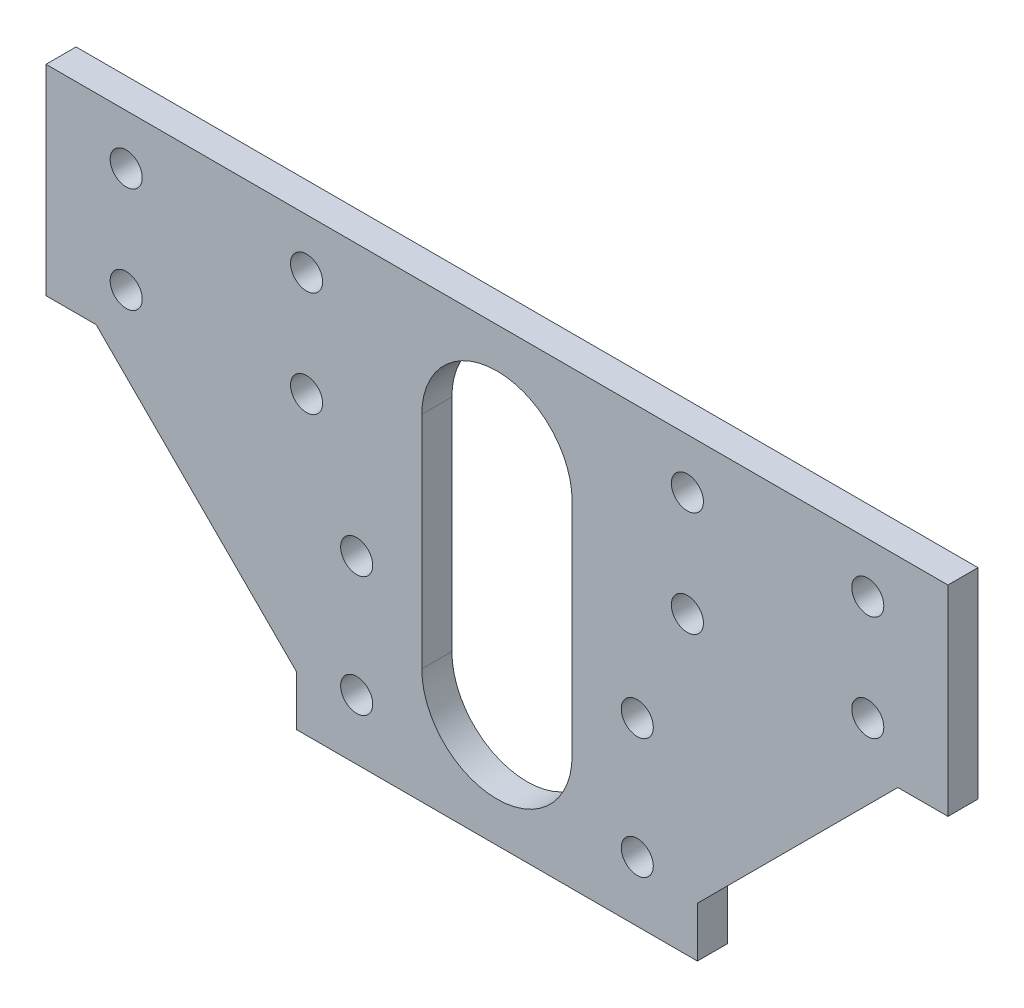
ISO-10303-21;
HEADER;
FILE_DESCRIPTION(('STEP AP214'),'2;1');
FILE_NAME('part.step','',(''),(''),'','','');
FILE_SCHEMA(('AUTOMOTIVE_DESIGN { 1 0 10303 214 1 1 1 1 }'));
ENDSEC;
DATA;
#1=APPLICATION_CONTEXT('core data for automotive mechanical design processes');
#2=APPLICATION_PROTOCOL_DEFINITION('international standard','automotive_design',2000,#1);
#3=PRODUCT_CONTEXT('',#1,'mechanical');
#4=PRODUCT('Part','Part','',(#3));
#5=PRODUCT_RELATED_PRODUCT_CATEGORY('part','',(#4));
#6=PRODUCT_DEFINITION_FORMATION('','',#4);
#7=PRODUCT_DEFINITION_CONTEXT('part definition',#1,'design');
#8=PRODUCT_DEFINITION('design','',#6,#7);
#9=PRODUCT_DEFINITION_SHAPE('','',#8);
#10=(LENGTH_UNIT() NAMED_UNIT(*) SI_UNIT(.MILLI.,.METRE.));
#11=(NAMED_UNIT(*) PLANE_ANGLE_UNIT() SI_UNIT($,.RADIAN.));
#12=(NAMED_UNIT(*) SI_UNIT($,.STERADIAN.) SOLID_ANGLE_UNIT());
#13=UNCERTAINTY_MEASURE_WITH_UNIT(LENGTH_MEASURE(1.E-05),#10,'distance_accuracy_value','');
#14=(GEOMETRIC_REPRESENTATION_CONTEXT(3) GLOBAL_UNCERTAINTY_ASSIGNED_CONTEXT((#13)) GLOBAL_UNIT_ASSIGNED_CONTEXT((#10,
#11,#12)) REPRESENTATION_CONTEXT('',''));
#15=CARTESIAN_POINT('',(0.,0.,0.));
#16=DIRECTION('',(0.,0.,1.));
#17=DIRECTION('',(1.,0.,0.));
#18=AXIS2_PLACEMENT_3D('',#15,#16,#17);
#19=CARTESIAN_POINT('',(0.,-20.,3.));
#20=DIRECTION('',(1.,0.,0.));
#21=DIRECTION('',(0.,0.,-1.));
#22=AXIS2_PLACEMENT_3D('',#19,#20,#21);
#23=PLANE('',#22);
#24=DIRECTION('',(0.,-1.,0.));
#25=VECTOR('',#24,1.);
#26=CARTESIAN_POINT('',(0.,-20.,0.));
#27=LINE('',#26,#25);
#28=CARTESIAN_POINT('',(0.,0.,0.));
#29=VERTEX_POINT('',#28);
#30=CARTESIAN_POINT('',(0.,-20.,0.));
#31=VERTEX_POINT('',#30);
#32=EDGE_CURVE('E239',#29,#31,#27,.T.);
#33=ORIENTED_EDGE('',*,*,#32,.T.);
#34=DIRECTION('',(0.,0.,-1.));
#35=VECTOR('',#34,1.);
#36=CARTESIAN_POINT('',(0.,-20.,3.));
#37=LINE('',#36,#35);
#38=CARTESIAN_POINT('',(0.,-20.,3.));
#39=VERTEX_POINT('',#38);
#40=EDGE_CURVE('E11',#39,#31,#37,.T.);
#41=ORIENTED_EDGE('',*,*,#40,.F.);
#42=DIRECTION('',(0.,-1.,0.));
#43=VECTOR('',#42,1.);
#44=CARTESIAN_POINT('',(0.,-20.,3.));
#45=LINE('',#44,#43);
#46=CARTESIAN_POINT('',(0.,0.,3.));
#47=VERTEX_POINT('',#46);
#48=EDGE_CURVE('E242',#47,#39,#45,.T.);
#49=ORIENTED_EDGE('',*,*,#48,.F.);
#50=DIRECTION('',(0.,0.,-1.));
#51=VECTOR('',#50,1.);
#52=CARTESIAN_POINT('',(0.,0.,3.));
#53=LINE('',#52,#51);
#54=EDGE_CURVE('E264',#47,#29,#53,.T.);
#55=ORIENTED_EDGE('',*,*,#54,.T.);
#56=EDGE_LOOP('',(#33,#41,#49,#55));
#57=FACE_BOUND('',#56,.T.);
#58=ADVANCED_FACE('F35',(#57),#23,.F.);
#59=CARTESIAN_POINT('',(5.,-20.,3.));
#60=DIRECTION('',(0.,1.,0.));
#61=DIRECTION('',(-1.,0.,0.));
#62=AXIS2_PLACEMENT_3D('',#59,#60,#61);
#63=PLANE('',#62);
#64=DIRECTION('',(1.,0.,0.));
#65=VECTOR('',#64,1.);
#66=CARTESIAN_POINT('',(5.,-20.,0.));
#67=LINE('',#66,#65);
#68=CARTESIAN_POINT('',(5.,-20.,0.));
#69=VERTEX_POINT('',#68);
#70=EDGE_CURVE('E267',#31,#69,#67,.T.);
#71=ORIENTED_EDGE('',*,*,#70,.T.);
#72=DIRECTION('',(0.,0.,-1.));
#73=VECTOR('',#72,1.);
#74=CARTESIAN_POINT('',(5.,-20.,3.));
#75=LINE('',#74,#73);
#76=CARTESIAN_POINT('',(5.,-20.,3.));
#77=VERTEX_POINT('',#76);
#78=EDGE_CURVE('E42',#77,#69,#75,.T.);
#79=ORIENTED_EDGE('',*,*,#78,.F.);
#80=DIRECTION('',(1.,0.,0.));
#81=VECTOR('',#80,1.);
#82=CARTESIAN_POINT('',(5.,-20.,3.));
#83=LINE('',#82,#81);
#84=EDGE_CURVE('E245',#39,#77,#83,.T.);
#85=ORIENTED_EDGE('',*,*,#84,.F.);
#86=ORIENTED_EDGE('',*,*,#40,.T.);
#87=EDGE_LOOP('',(#71,#79,#85,#86));
#88=FACE_BOUND('',#87,.T.);
#89=ADVANCED_FACE('F333',(#88),#63,.F.);
#90=CARTESIAN_POINT('',(25.,-39.9999999999998,3.));
#91=DIRECTION('',(0.707106781186543,0.707106781186552,0.));
#92=DIRECTION('',(-0.707106781186552,0.707106781186543,0.));
#93=AXIS2_PLACEMENT_3D('',#90,#91,#92);
#94=PLANE('',#93);
#95=DIRECTION('',(0.707106781186552,-0.707106781186543,0.));
#96=VECTOR('',#95,1.);
#97=CARTESIAN_POINT('',(25.,-39.9999999999998,0.));
#98=LINE('',#97,#96);
#99=CARTESIAN_POINT('',(25.,-39.9999999999998,0.));
#100=VERTEX_POINT('',#99);
#101=EDGE_CURVE('E269',#69,#100,#98,.T.);
#102=ORIENTED_EDGE('',*,*,#101,.T.);
#103=DIRECTION('',(0.,0.,-1.));
#104=VECTOR('',#103,1.);
#105=CARTESIAN_POINT('',(25.,-39.9999999999998,3.));
#106=LINE('',#105,#104);
#107=CARTESIAN_POINT('',(25.,-39.9999999999998,3.));
#108=VERTEX_POINT('',#107);
#109=EDGE_CURVE('E304',#108,#100,#106,.T.);
#110=ORIENTED_EDGE('',*,*,#109,.F.);
#111=DIRECTION('',(0.707106781186552,-0.707106781186543,0.));
#112=VECTOR('',#111,1.);
#113=CARTESIAN_POINT('',(25.,-39.9999999999998,3.));
#114=LINE('',#113,#112);
#115=EDGE_CURVE('E248',#77,#108,#114,.T.);
#116=ORIENTED_EDGE('',*,*,#115,.F.);
#117=ORIENTED_EDGE('',*,*,#78,.T.);
#118=EDGE_LOOP('',(#102,#110,#116,#117));
#119=FACE_BOUND('',#118,.T.);
#120=ADVANCED_FACE('F311',(#119),#94,.F.);
#121=CARTESIAN_POINT('',(25.,-45.,3.));
#122=DIRECTION('',(1.,0.,0.));
#123=DIRECTION('',(0.,0.,-1.));
#124=AXIS2_PLACEMENT_3D('',#121,#122,#123);
#125=PLANE('',#124);
#126=DIRECTION('',(0.,-1.,0.));
#127=VECTOR('',#126,1.);
#128=CARTESIAN_POINT('',(25.,-45.,0.));
#129=LINE('',#128,#127);
#130=CARTESIAN_POINT('',(25.,-45.,0.));
#131=VERTEX_POINT('',#130);
#132=EDGE_CURVE('E271',#100,#131,#129,.T.);
#133=ORIENTED_EDGE('',*,*,#132,.T.);
#134=DIRECTION('',(0.,0.,-1.));
#135=VECTOR('',#134,1.);
#136=CARTESIAN_POINT('',(25.,-45.,3.));
#137=LINE('',#136,#135);
#138=CARTESIAN_POINT('',(25.,-45.,3.));
#139=VERTEX_POINT('',#138);
#140=EDGE_CURVE('E301',#139,#131,#137,.T.);
#141=ORIENTED_EDGE('',*,*,#140,.F.);
#142=DIRECTION('',(0.,-1.,0.));
#143=VECTOR('',#142,1.);
#144=CARTESIAN_POINT('',(25.,-45.,3.));
#145=LINE('',#144,#143);
#146=EDGE_CURVE('E250',#108,#139,#145,.T.);
#147=ORIENTED_EDGE('',*,*,#146,.F.);
#148=ORIENTED_EDGE('',*,*,#109,.T.);
#149=EDGE_LOOP('',(#133,#141,#147,#148));
#150=FACE_BOUND('',#149,.T.);
#151=ADVANCED_FACE('F321',(#150),#125,.F.);
#152=CARTESIAN_POINT('',(65.,-45.,3.));
#153=DIRECTION('',(0.,1.,0.));
#154=DIRECTION('',(0.,0.,1.));
#155=AXIS2_PLACEMENT_3D('',#152,#153,#154);
#156=PLANE('',#155);
#157=DIRECTION('',(1.,0.,0.));
#158=VECTOR('',#157,1.);
#159=CARTESIAN_POINT('',(65.,-45.,0.));
#160=LINE('',#159,#158);
#161=CARTESIAN_POINT('',(65.,-45.,0.));
#162=VERTEX_POINT('',#161);
#163=EDGE_CURVE('E273',#131,#162,#160,.T.);
#164=ORIENTED_EDGE('',*,*,#163,.T.);
#165=DIRECTION('',(0.,0.,-1.));
#166=VECTOR('',#165,1.);
#167=CARTESIAN_POINT('',(65.,-45.,3.));
#168=LINE('',#167,#166);
#169=CARTESIAN_POINT('',(65.,-45.,3.));
#170=VERTEX_POINT('',#169);
#171=EDGE_CURVE('E298',#170,#162,#168,.T.);
#172=ORIENTED_EDGE('',*,*,#171,.F.);
#173=DIRECTION('',(1.,0.,0.));
#174=VECTOR('',#173,1.);
#175=CARTESIAN_POINT('',(65.,-45.,3.));
#176=LINE('',#175,#174);
#177=EDGE_CURVE('E252',#139,#170,#176,.T.);
#178=ORIENTED_EDGE('',*,*,#177,.F.);
#179=ORIENTED_EDGE('',*,*,#140,.T.);
#180=EDGE_LOOP('',(#164,#172,#178,#179));
#181=FACE_BOUND('',#180,.T.);
#182=ADVANCED_FACE('F325',(#181),#156,.F.);
#183=CARTESIAN_POINT('',(65.,-40.0000000000002,3.));
#184=DIRECTION('',(-1.,0.,0.));
#185=DIRECTION('',(0.,0.,1.));
#186=AXIS2_PLACEMENT_3D('',#183,#184,#185);
#187=PLANE('',#186);
#188=DIRECTION('',(0.,1.,0.));
#189=VECTOR('',#188,1.);
#190=CARTESIAN_POINT('',(65.,-40.0000000000002,0.));
#191=LINE('',#190,#189);
#192=CARTESIAN_POINT('',(65.,-40.0000000000002,0.));
#193=VERTEX_POINT('',#192);
#194=EDGE_CURVE('E275',#162,#193,#191,.T.);
#195=ORIENTED_EDGE('',*,*,#194,.T.);
#196=DIRECTION('',(0.,0.,-1.));
#197=VECTOR('',#196,1.);
#198=CARTESIAN_POINT('',(65.,-40.0000000000002,3.));
#199=LINE('',#198,#197);
#200=CARTESIAN_POINT('',(65.,-40.0000000000002,3.));
#201=VERTEX_POINT('',#200);
#202=EDGE_CURVE('E295',#201,#193,#199,.T.);
#203=ORIENTED_EDGE('',*,*,#202,.F.);
#204=DIRECTION('',(0.,1.,0.));
#205=VECTOR('',#204,1.);
#206=CARTESIAN_POINT('',(65.,-40.0000000000002,3.));
#207=LINE('',#206,#205);
#208=EDGE_CURVE('E254',#170,#201,#207,.T.);
#209=ORIENTED_EDGE('',*,*,#208,.F.);
#210=ORIENTED_EDGE('',*,*,#171,.T.);
#211=EDGE_LOOP('',(#195,#203,#209,#210));
#212=FACE_BOUND('',#211,.T.);
#213=ADVANCED_FACE('F356',(#212),#187,.F.);
#214=CARTESIAN_POINT('',(85.,-20.,3.));
#215=DIRECTION('',(-0.707106781186552,0.707106781186543,0.));
#216=DIRECTION('',(-0.707106781186543,-0.707106781186552,0.));
#217=AXIS2_PLACEMENT_3D('',#214,#215,#216);
#218=PLANE('',#217);
#219=DIRECTION('',(0.707106781186543,0.707106781186552,0.));
#220=VECTOR('',#219,1.);
#221=CARTESIAN_POINT('',(85.,-20.,0.));
#222=LINE('',#221,#220);
#223=CARTESIAN_POINT('',(85.,-20.,0.));
#224=VERTEX_POINT('',#223);
#225=EDGE_CURVE('E277',#193,#224,#222,.T.);
#226=ORIENTED_EDGE('',*,*,#225,.T.);
#227=DIRECTION('',(0.,0.,-1.));
#228=VECTOR('',#227,1.);
#229=CARTESIAN_POINT('',(85.,-20.,3.));
#230=LINE('',#229,#228);
#231=CARTESIAN_POINT('',(85.,-20.,3.));
#232=VERTEX_POINT('',#231);
#233=EDGE_CURVE('E292',#232,#224,#230,.T.);
#234=ORIENTED_EDGE('',*,*,#233,.F.);
#235=DIRECTION('',(0.707106781186543,0.707106781186552,0.));
#236=VECTOR('',#235,1.);
#237=CARTESIAN_POINT('',(85.,-20.,3.));
#238=LINE('',#237,#236);
#239=EDGE_CURVE('E256',#201,#232,#238,.T.);
#240=ORIENTED_EDGE('',*,*,#239,.F.);
#241=ORIENTED_EDGE('',*,*,#202,.T.);
#242=EDGE_LOOP('',(#226,#234,#240,#241));
#243=FACE_BOUND('',#242,.T.);
#244=ADVANCED_FACE('F353',(#243),#218,.F.);
#245=CARTESIAN_POINT('',(90.,-20.,3.));
#246=DIRECTION('',(0.,1.,0.));
#247=DIRECTION('',(0.,0.,1.));
#248=AXIS2_PLACEMENT_3D('',#245,#246,#247);
#249=PLANE('',#248);
#250=DIRECTION('',(1.,0.,0.));
#251=VECTOR('',#250,1.);
#252=CARTESIAN_POINT('',(90.,-20.,0.));
#253=LINE('',#252,#251);
#254=CARTESIAN_POINT('',(90.,-20.,0.));
#255=VERTEX_POINT('',#254);
#256=EDGE_CURVE('E279',#224,#255,#253,.T.);
#257=ORIENTED_EDGE('',*,*,#256,.T.);
#258=DIRECTION('',(0.,0.,-1.));
#259=VECTOR('',#258,1.);
#260=CARTESIAN_POINT('',(90.,-20.,3.));
#261=LINE('',#260,#259);
#262=CARTESIAN_POINT('',(90.,-20.,3.));
#263=VERTEX_POINT('',#262);
#264=EDGE_CURVE('E289',#263,#255,#261,.T.);
#265=ORIENTED_EDGE('',*,*,#264,.F.);
#266=DIRECTION('',(1.,0.,0.));
#267=VECTOR('',#266,1.);
#268=CARTESIAN_POINT('',(90.,-20.,3.));
#269=LINE('',#268,#267);
#270=EDGE_CURVE('E258',#232,#263,#269,.T.);
#271=ORIENTED_EDGE('',*,*,#270,.F.);
#272=ORIENTED_EDGE('',*,*,#233,.T.);
#273=EDGE_LOOP('',(#257,#265,#271,#272));
#274=FACE_BOUND('',#273,.T.);
#275=ADVANCED_FACE('F349',(#274),#249,.F.);
#276=CARTESIAN_POINT('',(90.,0.,3.));
#277=DIRECTION('',(-1.,0.,0.));
#278=DIRECTION('',(0.,0.,1.));
#279=AXIS2_PLACEMENT_3D('',#276,#277,#278);
#280=PLANE('',#279);
#281=DIRECTION('',(0.,1.,0.));
#282=VECTOR('',#281,1.);
#283=CARTESIAN_POINT('',(90.,0.,0.));
#284=LINE('',#283,#282);
#285=CARTESIAN_POINT('',(90.,0.,0.));
#286=VERTEX_POINT('',#285);
#287=EDGE_CURVE('E281',#255,#286,#284,.T.);
#288=ORIENTED_EDGE('',*,*,#287,.T.);
#289=DIRECTION('',(0.,0.,-1.));
#290=VECTOR('',#289,1.);
#291=CARTESIAN_POINT('',(90.,0.,3.));
#292=LINE('',#291,#290);
#293=CARTESIAN_POINT('',(90.,0.,3.));
#294=VERTEX_POINT('',#293);
#295=EDGE_CURVE('E286',#294,#286,#292,.T.);
#296=ORIENTED_EDGE('',*,*,#295,.F.);
#297=DIRECTION('',(0.,1.,0.));
#298=VECTOR('',#297,1.);
#299=CARTESIAN_POINT('',(90.,0.,3.));
#300=LINE('',#299,#298);
#301=EDGE_CURVE('E260',#263,#294,#300,.T.);
#302=ORIENTED_EDGE('',*,*,#301,.F.);
#303=ORIENTED_EDGE('',*,*,#264,.T.);
#304=EDGE_LOOP('',(#288,#296,#302,#303));
#305=FACE_BOUND('',#304,.T.);
#306=ADVANCED_FACE('F345',(#305),#280,.F.);
#307=CARTESIAN_POINT('',(0.,0.,3.));
#308=DIRECTION('',(0.,-1.,0.));
#309=DIRECTION('',(0.,0.,-1.));
#310=AXIS2_PLACEMENT_3D('',#307,#308,#309);
#311=PLANE('',#310);
#312=DIRECTION('',(-1.,0.,0.));
#313=VECTOR('',#312,1.);
#314=CARTESIAN_POINT('',(0.,0.,0.));
#315=LINE('',#314,#313);
#316=EDGE_CURVE('E246',#286,#29,#315,.T.);
#317=ORIENTED_EDGE('',*,*,#316,.T.);
#318=ORIENTED_EDGE('',*,*,#54,.F.);
#319=DIRECTION('',(-1.,0.,0.));
#320=VECTOR('',#319,1.);
#321=CARTESIAN_POINT('',(0.,0.,3.));
#322=LINE('',#321,#320);
#323=EDGE_CURVE('E262',#294,#47,#322,.T.);
#324=ORIENTED_EDGE('',*,*,#323,.F.);
#325=ORIENTED_EDGE('',*,*,#295,.T.);
#326=EDGE_LOOP('',(#317,#318,#324,#325));
#327=FACE_BOUND('',#326,.T.);
#328=ADVANCED_FACE('F340',(#327),#311,.F.);
#329=CARTESIAN_POINT('',(0.,0.,3.));
#330=DIRECTION('',(0.,0.,-1.));
#331=DIRECTION('',(-1.,0.,0.));
#332=AXIS2_PLACEMENT_3D('',#329,#330,#331);
#333=PLANE('',#332);
#334=CARTESIAN_POINT('',(26.,-15.5,3.));
#335=DIRECTION('',(0.,0.,1.));
#336=DIRECTION('',(1.,0.,0.));
#337=AXIS2_PLACEMENT_3D('',#334,#335,#336);
#338=CIRCLE('',#337,1.6);
#339=CARTESIAN_POINT('',(27.6,-15.5,3.));
#340=VERTEX_POINT('',#339);
#341=EDGE_CURVE('E204',#340,#340,#338,.T.);
#342=ORIENTED_EDGE('',*,*,#341,.F.);
#343=EDGE_LOOP('',(#342));
#344=FACE_BOUND('',#343,.T.);
#345=CARTESIAN_POINT('',(8.,-5.00000000000001,3.));
#346=DIRECTION('',(0.,0.,1.));
#347=DIRECTION('',(1.,0.,0.));
#348=AXIS2_PLACEMENT_3D('',#345,#346,#347);
#349=CIRCLE('',#348,1.6);
#350=CARTESIAN_POINT('',(9.6,-5.00000000000001,3.));
#351=VERTEX_POINT('',#350);
#352=EDGE_CURVE('E191',#351,#351,#349,.T.);
#353=ORIENTED_EDGE('',*,*,#352,.F.);
#354=EDGE_LOOP('',(#353));
#355=FACE_BOUND('',#354,.T.);
#356=CARTESIAN_POINT('',(8.,-15.5,3.));
#357=DIRECTION('',(0.,0.,1.));
#358=DIRECTION('',(1.,0.,0.));
#359=AXIS2_PLACEMENT_3D('',#356,#357,#358);
#360=CIRCLE('',#359,1.6);
#361=CARTESIAN_POINT('',(9.60000000000001,-15.5,3.));
#362=VERTEX_POINT('',#361);
#363=EDGE_CURVE('E192',#362,#362,#360,.T.);
#364=ORIENTED_EDGE('',*,*,#363,.F.);
#365=EDGE_LOOP('',(#364));
#366=FACE_BOUND('',#365,.T.);
#367=CARTESIAN_POINT('',(31.,-27.,3.));
#368=DIRECTION('',(0.,0.,1.));
#369=DIRECTION('',(1.,0.,0.));
#370=AXIS2_PLACEMENT_3D('',#367,#368,#369);
#371=CIRCLE('',#370,1.6);
#372=CARTESIAN_POINT('',(32.6,-27.,3.));
#373=VERTEX_POINT('',#372);
#374=EDGE_CURVE('E177',#373,#373,#371,.T.);
#375=ORIENTED_EDGE('',*,*,#374,.F.);
#376=EDGE_LOOP('',(#375));
#377=FACE_BOUND('',#376,.T.);
#378=CARTESIAN_POINT('',(26.,-5.00000000000001,3.));
#379=DIRECTION('',(0.,0.,1.));
#380=DIRECTION('',(1.,0.,0.));
#381=AXIS2_PLACEMENT_3D('',#378,#379,#380);
#382=CIRCLE('',#381,1.6);
#383=CARTESIAN_POINT('',(27.6,-5.00000000000001,3.));
#384=VERTEX_POINT('',#383);
#385=EDGE_CURVE('E203',#384,#384,#382,.T.);
#386=ORIENTED_EDGE('',*,*,#385,.F.);
#387=EDGE_LOOP('',(#386));
#388=FACE_BOUND('',#387,.T.);
#389=CARTESIAN_POINT('',(64.,-5.00000000000001,3.));
#390=DIRECTION('',(0.,0.,1.));
#391=DIRECTION('',(1.,0.,0.));
#392=AXIS2_PLACEMENT_3D('',#389,#390,#391);
#393=CIRCLE('',#392,1.60000000000001);
#394=CARTESIAN_POINT('',(65.6,-5.00000000000001,3.));
#395=VERTEX_POINT('',#394);
#396=EDGE_CURVE('E228',#395,#395,#393,.T.);
#397=ORIENTED_EDGE('',*,*,#396,.F.);
#398=EDGE_LOOP('',(#397));
#399=FACE_BOUND('',#398,.T.);
#400=CARTESIAN_POINT('',(64.,-15.5,3.));
#401=DIRECTION('',(0.,0.,1.));
#402=DIRECTION('',(1.,0.,0.));
#403=AXIS2_PLACEMENT_3D('',#400,#401,#402);
#404=CIRCLE('',#403,1.6);
#405=CARTESIAN_POINT('',(65.6,-15.5,3.));
#406=VERTEX_POINT('',#405);
#407=EDGE_CURVE('E222',#406,#406,#404,.T.);
#408=ORIENTED_EDGE('',*,*,#407,.F.);
#409=EDGE_LOOP('',(#408));
#410=FACE_BOUND('',#409,.T.);
#411=CARTESIAN_POINT('',(82.,-15.5,3.));
#412=DIRECTION('',(0.,0.,1.));
#413=DIRECTION('',(1.,0.,0.));
#414=AXIS2_PLACEMENT_3D('',#411,#412,#413);
#415=CIRCLE('',#414,1.6);
#416=CARTESIAN_POINT('',(83.6,-15.5,3.));
#417=VERTEX_POINT('',#416);
#418=EDGE_CURVE('E216',#417,#417,#415,.T.);
#419=ORIENTED_EDGE('',*,*,#418,.F.);
#420=EDGE_LOOP('',(#419));
#421=FACE_BOUND('',#420,.T.);
#422=DIRECTION('',(0.,-1.,0.));
#423=VECTOR('',#422,1.);
#424=CARTESIAN_POINT('',(37.5,-11.5,3.));
#425=LINE('',#424,#423);
#426=CARTESIAN_POINT('',(37.5,-11.5,3.));
#427=VERTEX_POINT('',#426);
#428=CARTESIAN_POINT('',(37.5,-33.5,3.));
#429=VERTEX_POINT('',#428);
#430=EDGE_CURVE('E165',#427,#429,#425,.T.);
#431=ORIENTED_EDGE('',*,*,#430,.F.);
#432=CARTESIAN_POINT('',(45.,-11.5,3.));
#433=DIRECTION('',(0.,0.,1.));
#434=DIRECTION('',(1.,0.,0.));
#435=AXIS2_PLACEMENT_3D('',#432,#433,#434);
#436=CIRCLE('',#435,7.50000000000001);
#437=CARTESIAN_POINT('',(52.5,-11.5,3.));
#438=VERTEX_POINT('',#437);
#439=EDGE_CURVE('E49',#438,#427,#436,.T.);
#440=ORIENTED_EDGE('',*,*,#439,.F.);
#441=DIRECTION('',(0.,1.,0.));
#442=VECTOR('',#441,1.);
#443=CARTESIAN_POINT('',(52.5,-11.5,3.));
#444=LINE('',#443,#442);
#445=CARTESIAN_POINT('',(52.5,-33.5,3.));
#446=VERTEX_POINT('',#445);
#447=EDGE_CURVE('E153',#446,#438,#444,.T.);
#448=ORIENTED_EDGE('',*,*,#447,.F.);
#449=CARTESIAN_POINT('',(45.,-33.5,3.));
#450=DIRECTION('',(0.,0.,1.));
#451=DIRECTION('',(1.,0.,0.));
#452=AXIS2_PLACEMENT_3D('',#449,#450,#451);
#453=CIRCLE('',#452,7.49999999999999);
#454=EDGE_CURVE('E156',#429,#446,#453,.T.);
#455=ORIENTED_EDGE('',*,*,#454,.F.);
#456=EDGE_LOOP('',(#431,#440,#448,#455));
#457=FACE_BOUND('',#456,.T.);
#458=CARTESIAN_POINT('',(59.,-39.,3.));
#459=DIRECTION('',(0.,0.,1.));
#460=DIRECTION('',(1.,0.,0.));
#461=AXIS2_PLACEMENT_3D('',#458,#459,#460);
#462=CIRCLE('',#461,1.6);
#463=CARTESIAN_POINT('',(60.6,-39.,3.));
#464=VERTEX_POINT('',#463);
#465=EDGE_CURVE('E159',#464,#464,#462,.T.);
#466=ORIENTED_EDGE('',*,*,#465,.F.);
#467=EDGE_LOOP('',(#466));
#468=FACE_BOUND('',#467,.T.);
#469=CARTESIAN_POINT('',(59.,-27.,3.));
#470=DIRECTION('',(0.,0.,1.));
#471=DIRECTION('',(1.,0.,0.));
#472=AXIS2_PLACEMENT_3D('',#469,#470,#471);
#473=CIRCLE('',#472,1.6);
#474=CARTESIAN_POINT('',(60.6,-27.,3.));
#475=VERTEX_POINT('',#474);
#476=EDGE_CURVE('E184',#475,#475,#473,.T.);
#477=ORIENTED_EDGE('',*,*,#476,.F.);
#478=EDGE_LOOP('',(#477));
#479=FACE_BOUND('',#478,.T.);
#480=CARTESIAN_POINT('',(31.,-39.,3.));
#481=DIRECTION('',(0.,0.,1.));
#482=DIRECTION('',(1.,0.,0.));
#483=AXIS2_PLACEMENT_3D('',#480,#481,#482);
#484=CIRCLE('',#483,1.6);
#485=CARTESIAN_POINT('',(32.6,-39.,3.));
#486=VERTEX_POINT('',#485);
#487=EDGE_CURVE('E178',#486,#486,#484,.T.);
#488=ORIENTED_EDGE('',*,*,#487,.F.);
#489=EDGE_LOOP('',(#488));
#490=FACE_BOUND('',#489,.T.);
#491=CARTESIAN_POINT('',(82.,-5.00000000000001,3.));
#492=DIRECTION('',(0.,0.,1.));
#493=DIRECTION('',(1.,0.,0.));
#494=AXIS2_PLACEMENT_3D('',#491,#492,#493);
#495=CIRCLE('',#494,1.60000000000001);
#496=CARTESIAN_POINT('',(83.6,-5.00000000000001,3.));
#497=VERTEX_POINT('',#496);
#498=EDGE_CURVE('E215',#497,#497,#495,.T.);
#499=ORIENTED_EDGE('',*,*,#498,.F.);
#500=EDGE_LOOP('',(#499));
#501=FACE_BOUND('',#500,.T.);
#502=ORIENTED_EDGE('',*,*,#48,.T.);
#503=ORIENTED_EDGE('',*,*,#84,.T.);
#504=ORIENTED_EDGE('',*,*,#115,.T.);
#505=ORIENTED_EDGE('',*,*,#146,.T.);
#506=ORIENTED_EDGE('',*,*,#177,.T.);
#507=ORIENTED_EDGE('',*,*,#208,.T.);
#508=ORIENTED_EDGE('',*,*,#239,.T.);
#509=ORIENTED_EDGE('',*,*,#270,.T.);
#510=ORIENTED_EDGE('',*,*,#301,.T.);
#511=ORIENTED_EDGE('',*,*,#323,.T.);
#512=EDGE_LOOP('',(#502,#503,#504,#505,#506,#507,#508,#509,#510,#511));
#513=FACE_BOUND('',#512,.T.);
#514=ADVANCED_FACE('F329',(#344,#355,#366,#377,#388,#399,#410,#421,#457,#468,#479,#490,#501,
#513),#333,.F.);
#515=CARTESIAN_POINT('',(0.,0.,0.));
#516=DIRECTION('',(0.,0.,-1.));
#517=DIRECTION('',(-1.,0.,0.));
#518=AXIS2_PLACEMENT_3D('',#515,#516,#517);
#519=PLANE('',#518);
#520=CARTESIAN_POINT('',(26.,-15.5,0.));
#521=DIRECTION('',(0.,0.,1.));
#522=DIRECTION('',(1.,0.,0.));
#523=AXIS2_PLACEMENT_3D('',#520,#521,#522);
#524=CIRCLE('',#523,1.6);
#525=CARTESIAN_POINT('',(27.6,-15.5,0.));
#526=VERTEX_POINT('',#525);
#527=EDGE_CURVE('E200',#526,#526,#524,.T.);
#528=ORIENTED_EDGE('',*,*,#527,.T.);
#529=EDGE_LOOP('',(#528));
#530=FACE_BOUND('',#529,.T.);
#531=CARTESIAN_POINT('',(8.,-5.00000000000001,0.));
#532=DIRECTION('',(0.,0.,1.));
#533=DIRECTION('',(1.,0.,0.));
#534=AXIS2_PLACEMENT_3D('',#531,#532,#533);
#535=CIRCLE('',#534,1.6);
#536=CARTESIAN_POINT('',(9.6,-5.00000000000001,0.));
#537=VERTEX_POINT('',#536);
#538=EDGE_CURVE('E207',#537,#537,#535,.T.);
#539=ORIENTED_EDGE('',*,*,#538,.T.);
#540=EDGE_LOOP('',(#539));
#541=FACE_BOUND('',#540,.T.);
#542=CARTESIAN_POINT('',(8.,-15.5,0.));
#543=DIRECTION('',(0.,0.,1.));
#544=DIRECTION('',(1.,0.,0.));
#545=AXIS2_PLACEMENT_3D('',#542,#543,#544);
#546=CIRCLE('',#545,1.6);
#547=CARTESIAN_POINT('',(9.60000000000001,-15.5,0.));
#548=VERTEX_POINT('',#547);
#549=EDGE_CURVE('E188',#548,#548,#546,.T.);
#550=ORIENTED_EDGE('',*,*,#549,.T.);
#551=EDGE_LOOP('',(#550));
#552=FACE_BOUND('',#551,.T.);
#553=CARTESIAN_POINT('',(31.,-27.,0.));
#554=DIRECTION('',(0.,0.,1.));
#555=DIRECTION('',(1.,0.,0.));
#556=AXIS2_PLACEMENT_3D('',#553,#554,#555);
#557=CIRCLE('',#556,1.6);
#558=CARTESIAN_POINT('',(32.6,-27.,0.));
#559=VERTEX_POINT('',#558);
#560=EDGE_CURVE('E195',#559,#559,#557,.T.);
#561=ORIENTED_EDGE('',*,*,#560,.T.);
#562=EDGE_LOOP('',(#561));
#563=FACE_BOUND('',#562,.T.);
#564=CARTESIAN_POINT('',(26.,-5.00000000000001,0.));
#565=DIRECTION('',(0.,0.,1.));
#566=DIRECTION('',(1.,0.,0.));
#567=AXIS2_PLACEMENT_3D('',#564,#565,#566);
#568=CIRCLE('',#567,1.6);
#569=CARTESIAN_POINT('',(27.6,-5.00000000000001,0.));
#570=VERTEX_POINT('',#569);
#571=EDGE_CURVE('E231',#570,#570,#568,.T.);
#572=ORIENTED_EDGE('',*,*,#571,.T.);
#573=EDGE_LOOP('',(#572));
#574=FACE_BOUND('',#573,.T.);
#575=CARTESIAN_POINT('',(64.,-5.00000000000001,0.));
#576=DIRECTION('',(0.,0.,1.));
#577=DIRECTION('',(1.,0.,0.));
#578=AXIS2_PLACEMENT_3D('',#575,#576,#577);
#579=CIRCLE('',#578,1.60000000000001);
#580=CARTESIAN_POINT('',(65.6,-5.00000000000001,0.));
#581=VERTEX_POINT('',#580);
#582=EDGE_CURVE('E225',#581,#581,#579,.T.);
#583=ORIENTED_EDGE('',*,*,#582,.T.);
#584=EDGE_LOOP('',(#583));
#585=FACE_BOUND('',#584,.T.);
#586=CARTESIAN_POINT('',(64.,-15.5,0.));
#587=DIRECTION('',(0.,0.,1.));
#588=DIRECTION('',(1.,0.,0.));
#589=AXIS2_PLACEMENT_3D('',#586,#587,#588);
#590=CIRCLE('',#589,1.6);
#591=CARTESIAN_POINT('',(65.6,-15.5,0.));
#592=VERTEX_POINT('',#591);
#593=EDGE_CURVE('E219',#592,#592,#590,.T.);
#594=ORIENTED_EDGE('',*,*,#593,.T.);
#595=EDGE_LOOP('',(#594));
#596=FACE_BOUND('',#595,.T.);
#597=CARTESIAN_POINT('',(82.,-15.5,0.));
#598=DIRECTION('',(0.,0.,1.));
#599=DIRECTION('',(1.,0.,0.));
#600=AXIS2_PLACEMENT_3D('',#597,#598,#599);
#601=CIRCLE('',#600,1.6);
#602=CARTESIAN_POINT('',(83.6,-15.5,0.));
#603=VERTEX_POINT('',#602);
#604=EDGE_CURVE('E212',#603,#603,#601,.T.);
#605=ORIENTED_EDGE('',*,*,#604,.T.);
#606=EDGE_LOOP('',(#605));
#607=FACE_BOUND('',#606,.T.);
#608=CARTESIAN_POINT('',(45.,-11.5,0.));
#609=DIRECTION('',(0.,0.,1.));
#610=DIRECTION('',(1.,0.,0.));
#611=AXIS2_PLACEMENT_3D('',#608,#609,#610);
#612=CIRCLE('',#611,7.50000000000001);
#613=CARTESIAN_POINT('',(52.5,-11.5,0.));
#614=VERTEX_POINT('',#613);
#615=CARTESIAN_POINT('',(37.5,-11.5,0.));
#616=VERTEX_POINT('',#615);
#617=EDGE_CURVE('E137',#614,#616,#612,.T.);
#618=ORIENTED_EDGE('',*,*,#617,.T.);
#619=DIRECTION('',(0.,-1.,0.));
#620=VECTOR('',#619,1.);
#621=CARTESIAN_POINT('',(37.5,-11.5,0.));
#622=LINE('',#621,#620);
#623=CARTESIAN_POINT('',(37.5,-33.5,0.));
#624=VERTEX_POINT('',#623);
#625=EDGE_CURVE('E146',#616,#624,#622,.T.);
#626=ORIENTED_EDGE('',*,*,#625,.T.);
#627=CARTESIAN_POINT('',(45.,-33.5,0.));
#628=DIRECTION('',(0.,0.,1.));
#629=DIRECTION('',(1.,0.,0.));
#630=AXIS2_PLACEMENT_3D('',#627,#628,#629);
#631=CIRCLE('',#630,7.49999999999999);
#632=CARTESIAN_POINT('',(52.5,-33.5,0.));
#633=VERTEX_POINT('',#632);
#634=EDGE_CURVE('E57',#624,#633,#631,.T.);
#635=ORIENTED_EDGE('',*,*,#634,.T.);
#636=DIRECTION('',(0.,1.,0.));
#637=VECTOR('',#636,1.);
#638=CARTESIAN_POINT('',(52.5,-11.5,0.));
#639=LINE('',#638,#637);
#640=EDGE_CURVE('E143',#633,#614,#639,.T.);
#641=ORIENTED_EDGE('',*,*,#640,.T.);
#642=EDGE_LOOP('',(#618,#626,#635,#641));
#643=FACE_BOUND('',#642,.T.);
#644=CARTESIAN_POINT('',(59.,-39.,0.));
#645=DIRECTION('',(0.,0.,1.));
#646=DIRECTION('',(1.,0.,0.));
#647=AXIS2_PLACEMENT_3D('',#644,#645,#646);
#648=CIRCLE('',#647,1.6);
#649=CARTESIAN_POINT('',(60.6,-39.,0.));
#650=VERTEX_POINT('',#649);
#651=EDGE_CURVE('E187',#650,#650,#648,.T.);
#652=ORIENTED_EDGE('',*,*,#651,.T.);
#653=EDGE_LOOP('',(#652));
#654=FACE_BOUND('',#653,.T.);
#655=CARTESIAN_POINT('',(59.,-27.,0.));
#656=DIRECTION('',(0.,0.,1.));
#657=DIRECTION('',(1.,0.,0.));
#658=AXIS2_PLACEMENT_3D('',#655,#656,#657);
#659=CIRCLE('',#658,1.6);
#660=CARTESIAN_POINT('',(60.6,-27.,0.));
#661=VERTEX_POINT('',#660);
#662=EDGE_CURVE('E181',#661,#661,#659,.T.);
#663=ORIENTED_EDGE('',*,*,#662,.T.);
#664=EDGE_LOOP('',(#663));
#665=FACE_BOUND('',#664,.T.);
#666=CARTESIAN_POINT('',(31.,-39.,0.));
#667=DIRECTION('',(0.,0.,1.));
#668=DIRECTION('',(1.,0.,0.));
#669=AXIS2_PLACEMENT_3D('',#666,#667,#668);
#670=CIRCLE('',#669,1.6);
#671=CARTESIAN_POINT('',(32.6,-39.,0.));
#672=VERTEX_POINT('',#671);
#673=EDGE_CURVE('E174',#672,#672,#670,.T.);
#674=ORIENTED_EDGE('',*,*,#673,.T.);
#675=EDGE_LOOP('',(#674));
#676=FACE_BOUND('',#675,.T.);
#677=CARTESIAN_POINT('',(82.,-5.00000000000001,0.));
#678=DIRECTION('',(0.,0.,1.));
#679=DIRECTION('',(1.,0.,0.));
#680=AXIS2_PLACEMENT_3D('',#677,#678,#679);
#681=CIRCLE('',#680,1.60000000000001);
#682=CARTESIAN_POINT('',(83.6,-5.00000000000001,0.));
#683=VERTEX_POINT('',#682);
#684=EDGE_CURVE('E236',#683,#683,#681,.T.);
#685=ORIENTED_EDGE('',*,*,#684,.T.);
#686=EDGE_LOOP('',(#685));
#687=FACE_BOUND('',#686,.T.);
#688=ORIENTED_EDGE('',*,*,#32,.F.);
#689=ORIENTED_EDGE('',*,*,#316,.F.);
#690=ORIENTED_EDGE('',*,*,#287,.F.);
#691=ORIENTED_EDGE('',*,*,#256,.F.);
#692=ORIENTED_EDGE('',*,*,#225,.F.);
#693=ORIENTED_EDGE('',*,*,#194,.F.);
#694=ORIENTED_EDGE('',*,*,#163,.F.);
#695=ORIENTED_EDGE('',*,*,#132,.F.);
#696=ORIENTED_EDGE('',*,*,#101,.F.);
#697=ORIENTED_EDGE('',*,*,#70,.F.);
#698=EDGE_LOOP('',(#688,#689,#690,#691,#692,#693,#694,#695,#696,#697));
#699=FACE_BOUND('',#698,.T.);
#700=ADVANCED_FACE('F150',(#530,#541,#552,#563,#574,#585,#596,#607,#643,#654,#665,#676,#687,
#699),#519,.T.);
#701=CARTESIAN_POINT('',(82.,-5.00000000000001,0.));
#702=DIRECTION('',(0.,0.,1.));
#703=DIRECTION('',(1.,0.,0.));
#704=AXIS2_PLACEMENT_3D('',#701,#702,#703);
#705=CYLINDRICAL_SURFACE('',#704,1.60000000000001);
#706=ORIENTED_EDGE('',*,*,#684,.F.);
#707=EDGE_LOOP('',(#706));
#708=FACE_BOUND('',#707,.T.);
#709=ORIENTED_EDGE('',*,*,#498,.T.);
#710=EDGE_LOOP('',(#709));
#711=FACE_BOUND('',#710,.T.);
#712=ADVANCED_FACE('F435',(#708,#711),#705,.F.);
#713=CARTESIAN_POINT('',(31.,-39.,0.));
#714=DIRECTION('',(0.,0.,1.));
#715=DIRECTION('',(1.,0.,0.));
#716=AXIS2_PLACEMENT_3D('',#713,#714,#715);
#717=CYLINDRICAL_SURFACE('',#716,1.6);
#718=ORIENTED_EDGE('',*,*,#673,.F.);
#719=EDGE_LOOP('',(#718));
#720=FACE_BOUND('',#719,.T.);
#721=ORIENTED_EDGE('',*,*,#487,.T.);
#722=EDGE_LOOP('',(#721));
#723=FACE_BOUND('',#722,.T.);
#724=ADVANCED_FACE('F445',(#720,#723),#717,.F.);
#725=CARTESIAN_POINT('',(59.,-27.,0.));
#726=DIRECTION('',(0.,0.,1.));
#727=DIRECTION('',(1.,0.,0.));
#728=AXIS2_PLACEMENT_3D('',#725,#726,#727);
#729=CYLINDRICAL_SURFACE('',#728,1.6);
#730=ORIENTED_EDGE('',*,*,#662,.F.);
#731=EDGE_LOOP('',(#730));
#732=FACE_BOUND('',#731,.T.);
#733=ORIENTED_EDGE('',*,*,#476,.T.);
#734=EDGE_LOOP('',(#733));
#735=FACE_BOUND('',#734,.T.);
#736=ADVANCED_FACE('F455',(#732,#735),#729,.F.);
#737=CARTESIAN_POINT('',(59.,-39.,0.));
#738=DIRECTION('',(0.,0.,1.));
#739=DIRECTION('',(1.,0.,0.));
#740=AXIS2_PLACEMENT_3D('',#737,#738,#739);
#741=CYLINDRICAL_SURFACE('',#740,1.6);
#742=ORIENTED_EDGE('',*,*,#651,.F.);
#743=EDGE_LOOP('',(#742));
#744=FACE_BOUND('',#743,.T.);
#745=ORIENTED_EDGE('',*,*,#465,.T.);
#746=EDGE_LOOP('',(#745));
#747=FACE_BOUND('',#746,.T.);
#748=ADVANCED_FACE('F465',(#744,#747),#741,.F.);
#749=CARTESIAN_POINT('',(45.,-11.5,0.));
#750=DIRECTION('',(0.,0.,1.));
#751=DIRECTION('',(1.,0.,0.));
#752=AXIS2_PLACEMENT_3D('',#749,#750,#751);
#753=CYLINDRICAL_SURFACE('',#752,7.50000000000001);
#754=ORIENTED_EDGE('',*,*,#439,.T.);
#755=DIRECTION('',(0.,0.,1.));
#756=VECTOR('',#755,1.);
#757=CARTESIAN_POINT('',(37.5,-11.5,0.));
#758=LINE('',#757,#756);
#759=EDGE_CURVE('E133',#616,#427,#758,.T.);
#760=ORIENTED_EDGE('',*,*,#759,.F.);
#761=ORIENTED_EDGE('',*,*,#617,.F.);
#762=DIRECTION('',(0.,0.,1.));
#763=VECTOR('',#762,1.);
#764=CARTESIAN_POINT('',(52.5,-11.5,0.));
#765=LINE('',#764,#763);
#766=EDGE_CURVE('E169',#614,#438,#765,.T.);
#767=ORIENTED_EDGE('',*,*,#766,.T.);
#768=EDGE_LOOP('',(#754,#760,#761,#767));
#769=FACE_BOUND('',#768,.T.);
#770=ADVANCED_FACE('F135',(#769),#753,.F.);
#771=CARTESIAN_POINT('',(52.5,-11.5,0.));
#772=DIRECTION('',(1.,0.,0.));
#773=DIRECTION('',(0.,1.,0.));
#774=AXIS2_PLACEMENT_3D('',#771,#772,#773);
#775=PLANE('',#774);
#776=ORIENTED_EDGE('',*,*,#447,.T.);
#777=ORIENTED_EDGE('',*,*,#766,.F.);
#778=ORIENTED_EDGE('',*,*,#640,.F.);
#779=DIRECTION('',(0.,0.,1.));
#780=VECTOR('',#779,1.);
#781=CARTESIAN_POINT('',(52.5,-33.5,0.));
#782=LINE('',#781,#780);
#783=EDGE_CURVE('E171',#633,#446,#782,.T.);
#784=ORIENTED_EDGE('',*,*,#783,.T.);
#785=EDGE_LOOP('',(#776,#777,#778,#784));
#786=FACE_BOUND('',#785,.T.);
#787=ADVANCED_FACE('F484',(#786),#775,.F.);
#788=CARTESIAN_POINT('',(45.,-33.5,0.));
#789=DIRECTION('',(0.,0.,1.));
#790=DIRECTION('',(1.,0.,0.));
#791=AXIS2_PLACEMENT_3D('',#788,#789,#790);
#792=CYLINDRICAL_SURFACE('',#791,7.49999999999999);
#793=ORIENTED_EDGE('',*,*,#454,.T.);
#794=ORIENTED_EDGE('',*,*,#783,.F.);
#795=ORIENTED_EDGE('',*,*,#634,.F.);
#796=DIRECTION('',(0.,0.,1.));
#797=VECTOR('',#796,1.);
#798=CARTESIAN_POINT('',(37.5,-33.5,0.));
#799=LINE('',#798,#797);
#800=EDGE_CURVE('E142',#624,#429,#799,.T.);
#801=ORIENTED_EDGE('',*,*,#800,.T.);
#802=EDGE_LOOP('',(#793,#794,#795,#801));
#803=FACE_BOUND('',#802,.T.);
#804=ADVANCED_FACE('F493',(#803),#792,.F.);
#805=CARTESIAN_POINT('',(37.5,-11.5,0.));
#806=DIRECTION('',(-1.,0.,0.));
#807=DIRECTION('',(0.,-1.,0.));
#808=AXIS2_PLACEMENT_3D('',#805,#806,#807);
#809=PLANE('',#808);
#810=ORIENTED_EDGE('',*,*,#430,.T.);
#811=ORIENTED_EDGE('',*,*,#800,.F.);
#812=ORIENTED_EDGE('',*,*,#625,.F.);
#813=ORIENTED_EDGE('',*,*,#759,.T.);
#814=EDGE_LOOP('',(#810,#811,#812,#813));
#815=FACE_BOUND('',#814,.T.);
#816=ADVANCED_FACE('F147',(#815),#809,.F.);
#817=CARTESIAN_POINT('',(82.,-15.5,0.));
#818=DIRECTION('',(0.,0.,1.));
#819=DIRECTION('',(1.,0.,0.));
#820=AXIS2_PLACEMENT_3D('',#817,#818,#819);
#821=CYLINDRICAL_SURFACE('',#820,1.6);
#822=ORIENTED_EDGE('',*,*,#604,.F.);
#823=EDGE_LOOP('',(#822));
#824=FACE_BOUND('',#823,.T.);
#825=ORIENTED_EDGE('',*,*,#418,.T.);
#826=EDGE_LOOP('',(#825));
#827=FACE_BOUND('',#826,.T.);
#828=ADVANCED_FACE('F511',(#824,#827),#821,.F.);
#829=CARTESIAN_POINT('',(64.,-15.5,0.));
#830=DIRECTION('',(0.,0.,1.));
#831=DIRECTION('',(1.,0.,0.));
#832=AXIS2_PLACEMENT_3D('',#829,#830,#831);
#833=CYLINDRICAL_SURFACE('',#832,1.6);
#834=ORIENTED_EDGE('',*,*,#593,.F.);
#835=EDGE_LOOP('',(#834));
#836=FACE_BOUND('',#835,.T.);
#837=ORIENTED_EDGE('',*,*,#407,.T.);
#838=EDGE_LOOP('',(#837));
#839=FACE_BOUND('',#838,.T.);
#840=ADVANCED_FACE('F520',(#836,#839),#833,.F.);
#841=CARTESIAN_POINT('',(64.,-5.00000000000001,0.));
#842=DIRECTION('',(0.,0.,1.));
#843=DIRECTION('',(1.,0.,0.));
#844=AXIS2_PLACEMENT_3D('',#841,#842,#843);
#845=CYLINDRICAL_SURFACE('',#844,1.60000000000001);
#846=ORIENTED_EDGE('',*,*,#582,.F.);
#847=EDGE_LOOP('',(#846));
#848=FACE_BOUND('',#847,.T.);
#849=ORIENTED_EDGE('',*,*,#396,.T.);
#850=EDGE_LOOP('',(#849));
#851=FACE_BOUND('',#850,.T.);
#852=ADVANCED_FACE('F530',(#848,#851),#845,.F.);
#853=CARTESIAN_POINT('',(26.,-5.00000000000001,0.));
#854=DIRECTION('',(0.,0.,1.));
#855=DIRECTION('',(1.,0.,0.));
#856=AXIS2_PLACEMENT_3D('',#853,#854,#855);
#857=CYLINDRICAL_SURFACE('',#856,1.6);
#858=ORIENTED_EDGE('',*,*,#571,.F.);
#859=EDGE_LOOP('',(#858));
#860=FACE_BOUND('',#859,.T.);
#861=ORIENTED_EDGE('',*,*,#385,.T.);
#862=EDGE_LOOP('',(#861));
#863=FACE_BOUND('',#862,.T.);
#864=ADVANCED_FACE('F540',(#860,#863),#857,.F.);
#865=CARTESIAN_POINT('',(31.,-27.,0.));
#866=DIRECTION('',(0.,0.,1.));
#867=DIRECTION('',(1.,0.,0.));
#868=AXIS2_PLACEMENT_3D('',#865,#866,#867);
#869=CYLINDRICAL_SURFACE('',#868,1.6);
#870=ORIENTED_EDGE('',*,*,#560,.F.);
#871=EDGE_LOOP('',(#870));
#872=FACE_BOUND('',#871,.T.);
#873=ORIENTED_EDGE('',*,*,#374,.T.);
#874=EDGE_LOOP('',(#873));
#875=FACE_BOUND('',#874,.T.);
#876=ADVANCED_FACE('F550',(#872,#875),#869,.F.);
#877=CARTESIAN_POINT('',(8.,-15.5,0.));
#878=DIRECTION('',(0.,0.,1.));
#879=DIRECTION('',(1.,0.,0.));
#880=AXIS2_PLACEMENT_3D('',#877,#878,#879);
#881=CYLINDRICAL_SURFACE('',#880,1.6);
#882=ORIENTED_EDGE('',*,*,#549,.F.);
#883=EDGE_LOOP('',(#882));
#884=FACE_BOUND('',#883,.T.);
#885=ORIENTED_EDGE('',*,*,#363,.T.);
#886=EDGE_LOOP('',(#885));
#887=FACE_BOUND('',#886,.T.);
#888=ADVANCED_FACE('F560',(#884,#887),#881,.F.);
#889=CARTESIAN_POINT('',(8.,-5.00000000000001,0.));
#890=DIRECTION('',(0.,0.,1.));
#891=DIRECTION('',(1.,0.,0.));
#892=AXIS2_PLACEMENT_3D('',#889,#890,#891);
#893=CYLINDRICAL_SURFACE('',#892,1.6);
#894=ORIENTED_EDGE('',*,*,#538,.F.);
#895=EDGE_LOOP('',(#894));
#896=FACE_BOUND('',#895,.T.);
#897=ORIENTED_EDGE('',*,*,#352,.T.);
#898=EDGE_LOOP('',(#897));
#899=FACE_BOUND('',#898,.T.);
#900=ADVANCED_FACE('F570',(#896,#899),#893,.F.);
#901=CARTESIAN_POINT('',(26.,-15.5,0.));
#902=DIRECTION('',(0.,0.,1.));
#903=DIRECTION('',(1.,0.,0.));
#904=AXIS2_PLACEMENT_3D('',#901,#902,#903);
#905=CYLINDRICAL_SURFACE('',#904,1.6);
#906=ORIENTED_EDGE('',*,*,#527,.F.);
#907=EDGE_LOOP('',(#906));
#908=FACE_BOUND('',#907,.T.);
#909=ORIENTED_EDGE('',*,*,#341,.T.);
#910=EDGE_LOOP('',(#909));
#911=FACE_BOUND('',#910,.T.);
#912=ADVANCED_FACE('F580',(#908,#911),#905,.F.);
#913=CLOSED_SHELL('',(#58,#89,#120,#151,#182,#213,#244,#275,#306,#328,#514,#700,#712,#724,#736,
#748,#770,#787,#804,#816,#828,#840,#852,#864,#876,#888,#900,#912));
#914=MANIFOLD_SOLID_BREP('B2',#913);
#915=ADVANCED_BREP_SHAPE_REPRESENTATION('',(#18,#914),#14);
#916=SHAPE_DEFINITION_REPRESENTATION(#9,#915);
ENDSEC;
END-ISO-10303-21;
